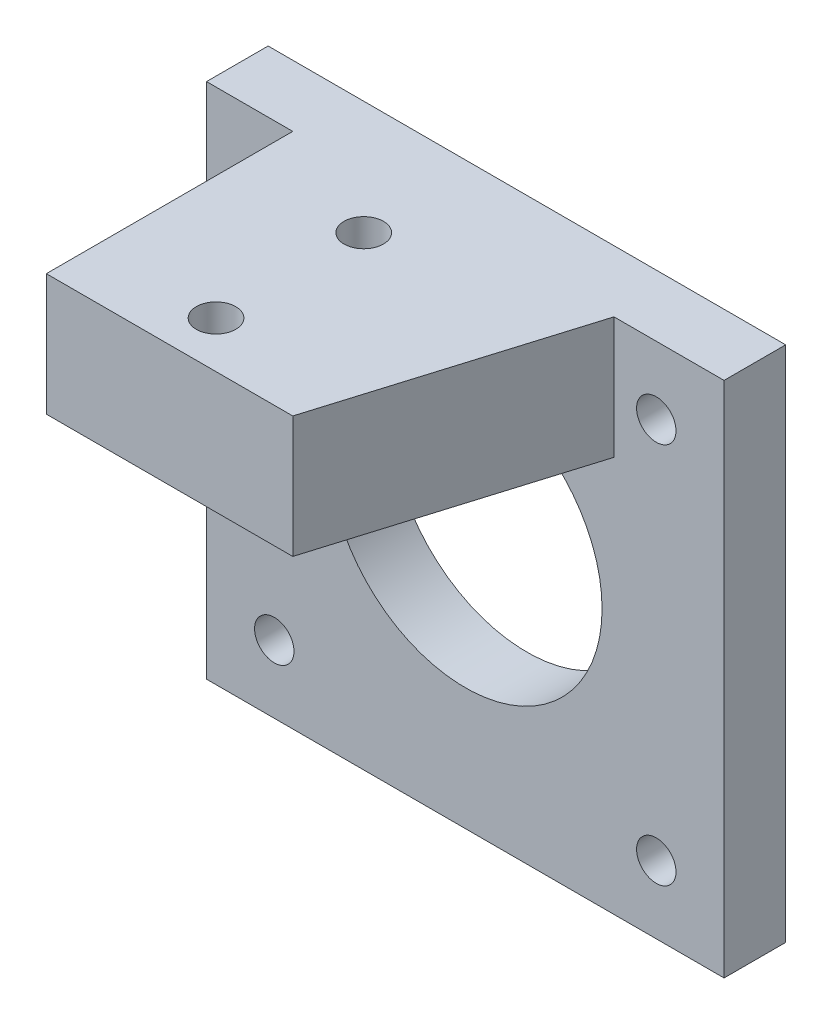
ISO-10303-21;
HEADER;
FILE_DESCRIPTION(('STEP AP214'),'2;1');
FILE_NAME('part.step','',(''),(''),'','','');
FILE_SCHEMA(('AUTOMOTIVE_DESIGN { 1 0 10303 214 1 1 1 1 }'));
ENDSEC;
DATA;
#1=APPLICATION_CONTEXT('core data for automotive mechanical design processes');
#2=APPLICATION_PROTOCOL_DEFINITION('international standard','automotive_design',2000,#1);
#3=PRODUCT_CONTEXT('',#1,'mechanical');
#4=PRODUCT('Part','Part','',(#3));
#5=PRODUCT_RELATED_PRODUCT_CATEGORY('part','',(#4));
#6=PRODUCT_DEFINITION_FORMATION('','',#4);
#7=PRODUCT_DEFINITION_CONTEXT('part definition',#1,'design');
#8=PRODUCT_DEFINITION('design','',#6,#7);
#9=PRODUCT_DEFINITION_SHAPE('','',#8);
#10=(LENGTH_UNIT() NAMED_UNIT(*) SI_UNIT(.MILLI.,.METRE.));
#11=(NAMED_UNIT(*) PLANE_ANGLE_UNIT() SI_UNIT($,.RADIAN.));
#12=(NAMED_UNIT(*) SI_UNIT($,.STERADIAN.) SOLID_ANGLE_UNIT());
#13=UNCERTAINTY_MEASURE_WITH_UNIT(LENGTH_MEASURE(1.E-05),#10,'distance_accuracy_value','');
#14=(GEOMETRIC_REPRESENTATION_CONTEXT(3) GLOBAL_UNCERTAINTY_ASSIGNED_CONTEXT((#13)) GLOBAL_UNIT_ASSIGNED_CONTEXT((#10,
#11,#12)) REPRESENTATION_CONTEXT('',''));
#15=CARTESIAN_POINT('',(0.,0.,0.));
#16=DIRECTION('',(0.,0.,1.));
#17=DIRECTION('',(1.,0.,0.));
#18=AXIS2_PLACEMENT_3D('',#15,#16,#17);
#19=CARTESIAN_POINT('',(17.,52.1256764127012,9.24121157828495));
#20=DIRECTION('',(0.,-1.,0.));
#21=DIRECTION('',(0.,0.,-1.));
#22=AXIS2_PLACEMENT_3D('',#19,#20,#21);
#23=CYLINDRICAL_SURFACE('',#22,1.6);
#24=CARTESIAN_POINT('',(17.,42.,9.24121157828495));
#25=DIRECTION('',(0.,-1.,0.));
#26=DIRECTION('',(0.,0.,-1.));
#27=AXIS2_PLACEMENT_3D('',#24,#25,#26);
#28=CIRCLE('',#27,1.6);
#29=CARTESIAN_POINT('',(17.,42.,7.64121157828495));
#30=VERTEX_POINT('',#29);
#31=EDGE_CURVE('E225',#30,#30,#28,.T.);
#32=ORIENTED_EDGE('',*,*,#31,.F.);
#33=EDGE_LOOP('',(#32));
#34=FACE_BOUND('',#33,.T.);
#35=CARTESIAN_POINT('',(17.,35.1256764127012,9.24121157828495));
#36=DIRECTION('',(0.,-1.,0.));
#37=DIRECTION('',(0.,0.,-1.));
#38=AXIS2_PLACEMENT_3D('',#35,#36,#37);
#39=CIRCLE('',#38,1.6);
#40=CARTESIAN_POINT('',(17.,35.1256764127012,7.64121157828495));
#41=VERTEX_POINT('',#40);
#42=EDGE_CURVE('E38',#41,#41,#39,.F.);
#43=ORIENTED_EDGE('',*,*,#42,.F.);
#44=EDGE_LOOP('',(#43));
#45=FACE_BOUND('',#44,.T.);
#46=ADVANCED_FACE('F34',(#34,#45),#23,.F.);
#47=CARTESIAN_POINT('',(17.,52.1256764127012,21.2289962843215));
#48=DIRECTION('',(0.,-1.,0.));
#49=DIRECTION('',(0.,0.,-1.));
#50=AXIS2_PLACEMENT_3D('',#47,#48,#49);
#51=CYLINDRICAL_SURFACE('',#50,1.6);
#52=CARTESIAN_POINT('',(17.,42.,21.2289962843215));
#53=DIRECTION('',(0.,-1.,0.));
#54=DIRECTION('',(0.,0.,-1.));
#55=AXIS2_PLACEMENT_3D('',#52,#53,#54);
#56=CIRCLE('',#55,1.6);
#57=CARTESIAN_POINT('',(17.,42.,19.6289962843215));
#58=VERTEX_POINT('',#57);
#59=EDGE_CURVE('E218',#58,#58,#56,.T.);
#60=ORIENTED_EDGE('',*,*,#59,.F.);
#61=EDGE_LOOP('',(#60));
#62=FACE_BOUND('',#61,.T.);
#63=CARTESIAN_POINT('',(17.,35.1256764127012,21.2289962843215));
#64=DIRECTION('',(0.,-1.,0.));
#65=DIRECTION('',(0.,0.,-1.));
#66=AXIS2_PLACEMENT_3D('',#63,#64,#65);
#67=CIRCLE('',#66,1.6);
#68=CARTESIAN_POINT('',(17.,35.1256764127012,19.6289962843215));
#69=VERTEX_POINT('',#68);
#70=EDGE_CURVE('E223',#69,#69,#67,.F.);
#71=ORIENTED_EDGE('',*,*,#70,.F.);
#72=EDGE_LOOP('',(#71));
#73=FACE_BOUND('',#72,.T.);
#74=ADVANCED_FACE('F287',(#62,#73),#51,.F.);
#75=CARTESIAN_POINT('',(0.,0.,5.));
#76=DIRECTION('',(0.,0.,-1.));
#77=DIRECTION('',(-1.,0.,0.));
#78=AXIS2_PLACEMENT_3D('',#75,#76,#77);
#79=PLANE('',#78);
#80=CARTESIAN_POINT('',(20.9999999999933,20.9999999999933,5.));
#81=DIRECTION('',(0.,0.,1.));
#82=DIRECTION('',(1.,0.,0.));
#83=AXIS2_PLACEMENT_3D('',#80,#81,#82);
#84=CIRCLE('',#83,11.1);
#85=CARTESIAN_POINT('',(32.0999999999933,20.9999999999933,5.));
#86=VERTEX_POINT('',#85);
#87=EDGE_CURVE('E150',#86,#86,#84,.T.);
#88=ORIENTED_EDGE('',*,*,#87,.F.);
#89=EDGE_LOOP('',(#88));
#90=FACE_BOUND('',#89,.T.);
#91=CARTESIAN_POINT('',(36.4999999999933,36.4999999999933,5.));
#92=DIRECTION('',(0.,0.,1.));
#93=DIRECTION('',(-1.,0.,0.));
#94=AXIS2_PLACEMENT_3D('',#91,#92,#93);
#95=CIRCLE('',#94,1.6);
#96=CARTESIAN_POINT('',(34.8999999999933,36.4999999999933,5.));
#97=VERTEX_POINT('',#96);
#98=EDGE_CURVE('E192',#97,#97,#95,.T.);
#99=ORIENTED_EDGE('',*,*,#98,.F.);
#100=EDGE_LOOP('',(#99));
#101=FACE_BOUND('',#100,.T.);
#102=CARTESIAN_POINT('',(36.4999999999933,5.49999999999329,5.));
#103=DIRECTION('',(0.,0.,1.));
#104=DIRECTION('',(1.,0.,0.));
#105=AXIS2_PLACEMENT_3D('',#102,#103,#104);
#106=CIRCLE('',#105,1.6);
#107=CARTESIAN_POINT('',(38.0999999999933,5.49999999999329,5.));
#108=VERTEX_POINT('',#107);
#109=EDGE_CURVE('E199',#108,#108,#106,.T.);
#110=ORIENTED_EDGE('',*,*,#109,.F.);
#111=EDGE_LOOP('',(#110));
#112=FACE_BOUND('',#111,.T.);
#113=CARTESIAN_POINT('',(5.49999999999329,5.49999999999328,5.));
#114=DIRECTION('',(0.,0.,1.));
#115=DIRECTION('',(-1.,0.,0.));
#116=AXIS2_PLACEMENT_3D('',#113,#114,#115);
#117=CIRCLE('',#116,1.6);
#118=CARTESIAN_POINT('',(3.89999999999329,5.49999999999328,5.));
#119=VERTEX_POINT('',#118);
#120=EDGE_CURVE('E205',#119,#119,#117,.T.);
#121=ORIENTED_EDGE('',*,*,#120,.F.);
#122=EDGE_LOOP('',(#121));
#123=FACE_BOUND('',#122,.T.);
#124=DIRECTION('',(-1.,0.,0.));
#125=VECTOR('',#124,1.);
#126=CARTESIAN_POINT('',(0.,42.,5.));
#127=LINE('',#126,#125);
#128=CARTESIAN_POINT('',(42.,42.,5.));
#129=VERTEX_POINT('',#128);
#130=CARTESIAN_POINT('',(33.0663127071823,42.,5.));
#131=VERTEX_POINT('',#130);
#132=EDGE_CURVE('E122',#129,#131,#127,.T.);
#133=ORIENTED_EDGE('',*,*,#132,.T.);
#134=DIRECTION('',(0.,-1.,0.));
#135=VECTOR('',#134,1.);
#136=CARTESIAN_POINT('',(33.0663127071823,42.,5.));
#137=LINE('',#136,#135);
#138=CARTESIAN_POINT('',(33.0663127071823,32.1256764127012,5.));
#139=VERTEX_POINT('',#138);
#140=EDGE_CURVE('E106',#131,#139,#137,.T.);
#141=ORIENTED_EDGE('',*,*,#140,.T.);
#142=DIRECTION('',(1.,0.,0.));
#143=VECTOR('',#142,1.);
#144=CARTESIAN_POINT('',(7.,32.1256764127012,5.));
#145=LINE('',#144,#143);
#146=CARTESIAN_POINT('',(7.,32.1256764127012,5.));
#147=VERTEX_POINT('',#146);
#148=EDGE_CURVE('E52',#147,#139,#145,.T.);
#149=ORIENTED_EDGE('',*,*,#148,.F.);
#150=DIRECTION('',(0.,-1.,0.));
#151=VECTOR('',#150,1.);
#152=CARTESIAN_POINT('',(7.,42.,5.));
#153=LINE('',#152,#151);
#154=CARTESIAN_POINT('',(7.,35.9432235637284,5.));
#155=VERTEX_POINT('',#154);
#156=EDGE_CURVE('E11',#155,#147,#153,.T.);
#157=ORIENTED_EDGE('',*,*,#156,.F.);
#158=CARTESIAN_POINT('',(5.49999999999329,36.4999999999933,5.));
#159=DIRECTION('',(0.,0.,1.));
#160=DIRECTION('',(1.,0.,0.));
#161=AXIS2_PLACEMENT_3D('',#158,#159,#160);
#162=CIRCLE('',#161,1.6);
#163=CARTESIAN_POINT('',(7.,37.0567764362582,5.));
#164=VERTEX_POINT('',#163);
#165=EDGE_CURVE('E186',#164,#155,#162,.T.);
#166=ORIENTED_EDGE('',*,*,#165,.F.);
#167=CARTESIAN_POINT('',(7.,42.,5.));
#168=VERTEX_POINT('',#167);
#169=EDGE_CURVE('E58',#168,#164,#153,.T.);
#170=ORIENTED_EDGE('',*,*,#169,.F.);
#171=CARTESIAN_POINT('',(0.,42.,5.));
#172=VERTEX_POINT('',#171);
#173=EDGE_CURVE('E131',#168,#172,#127,.T.);
#174=ORIENTED_EDGE('',*,*,#173,.T.);
#175=DIRECTION('',(0.,-1.,0.));
#176=VECTOR('',#175,1.);
#177=CARTESIAN_POINT('',(0.,0.,5.));
#178=LINE('',#177,#176);
#179=CARTESIAN_POINT('',(0.,0.,5.));
#180=VERTEX_POINT('',#179);
#181=EDGE_CURVE('E155',#172,#180,#178,.T.);
#182=ORIENTED_EDGE('',*,*,#181,.T.);
#183=DIRECTION('',(1.,0.,0.));
#184=VECTOR('',#183,1.);
#185=CARTESIAN_POINT('',(0.,0.,5.));
#186=LINE('',#185,#184);
#187=CARTESIAN_POINT('',(42.,0.,5.));
#188=VERTEX_POINT('',#187);
#189=EDGE_CURVE('E166',#180,#188,#186,.T.);
#190=ORIENTED_EDGE('',*,*,#189,.T.);
#191=DIRECTION('',(0.,1.,0.));
#192=VECTOR('',#191,1.);
#193=CARTESIAN_POINT('',(42.,0.,5.));
#194=LINE('',#193,#192);
#195=EDGE_CURVE('E128',#188,#129,#194,.T.);
#196=ORIENTED_EDGE('',*,*,#195,.T.);
#197=EDGE_LOOP('',(#133,#141,#149,#157,#166,#170,#174,#182,#190,#196));
#198=FACE_BOUND('',#197,.T.);
#199=ADVANCED_FACE('F126',(#90,#101,#112,#123,#198),#79,.F.);
#200=CARTESIAN_POINT('',(0.,0.,0.));
#201=DIRECTION('',(0.,0.,-1.));
#202=DIRECTION('',(-1.,0.,0.));
#203=AXIS2_PLACEMENT_3D('',#200,#201,#202);
#204=PLANE('',#203);
#205=CARTESIAN_POINT('',(5.49999999999329,5.49999999999328,0.));
#206=DIRECTION('',(0.,0.,1.));
#207=DIRECTION('',(-1.,0.,0.));
#208=AXIS2_PLACEMENT_3D('',#205,#206,#207);
#209=CIRCLE('',#208,1.6);
#210=CARTESIAN_POINT('',(3.89999999999329,5.49999999999328,0.));
#211=VERTEX_POINT('',#210);
#212=EDGE_CURVE('E202',#211,#211,#209,.T.);
#213=ORIENTED_EDGE('',*,*,#212,.T.);
#214=EDGE_LOOP('',(#213));
#215=FACE_BOUND('',#214,.T.);
#216=CARTESIAN_POINT('',(36.4999999999933,5.49999999999329,0.));
#217=DIRECTION('',(0.,0.,1.));
#218=DIRECTION('',(1.,0.,0.));
#219=AXIS2_PLACEMENT_3D('',#216,#217,#218);
#220=CIRCLE('',#219,1.6);
#221=CARTESIAN_POINT('',(38.0999999999933,5.49999999999329,0.));
#222=VERTEX_POINT('',#221);
#223=EDGE_CURVE('E196',#222,#222,#220,.T.);
#224=ORIENTED_EDGE('',*,*,#223,.T.);
#225=EDGE_LOOP('',(#224));
#226=FACE_BOUND('',#225,.T.);
#227=CARTESIAN_POINT('',(36.4999999999933,36.4999999999933,0.));
#228=DIRECTION('',(0.,0.,1.));
#229=DIRECTION('',(-1.,0.,0.));
#230=AXIS2_PLACEMENT_3D('',#227,#228,#229);
#231=CIRCLE('',#230,1.6);
#232=CARTESIAN_POINT('',(34.8999999999933,36.4999999999933,0.));
#233=VERTEX_POINT('',#232);
#234=EDGE_CURVE('E195',#233,#233,#231,.T.);
#235=ORIENTED_EDGE('',*,*,#234,.T.);
#236=EDGE_LOOP('',(#235));
#237=FACE_BOUND('',#236,.T.);
#238=CARTESIAN_POINT('',(5.49999999999329,36.4999999999933,0.));
#239=DIRECTION('',(0.,0.,1.));
#240=DIRECTION('',(1.,0.,0.));
#241=AXIS2_PLACEMENT_3D('',#238,#239,#240);
#242=CIRCLE('',#241,1.6);
#243=CARTESIAN_POINT('',(7.09999999999329,36.4999999999933,0.));
#244=VERTEX_POINT('',#243);
#245=EDGE_CURVE('E183',#244,#244,#242,.T.);
#246=ORIENTED_EDGE('',*,*,#245,.T.);
#247=EDGE_LOOP('',(#246));
#248=FACE_BOUND('',#247,.T.);
#249=DIRECTION('',(0.,-1.,0.));
#250=VECTOR('',#249,1.);
#251=CARTESIAN_POINT('',(0.,0.,0.));
#252=LINE('',#251,#250);
#253=CARTESIAN_POINT('',(0.,42.,0.));
#254=VERTEX_POINT('',#253);
#255=CARTESIAN_POINT('',(0.,0.,0.));
#256=VERTEX_POINT('',#255);
#257=EDGE_CURVE('E145',#254,#256,#252,.T.);
#258=ORIENTED_EDGE('',*,*,#257,.F.);
#259=DIRECTION('',(-1.,0.,0.));
#260=VECTOR('',#259,1.);
#261=CARTESIAN_POINT('',(0.,42.,0.));
#262=LINE('',#261,#260);
#263=CARTESIAN_POINT('',(42.,42.,0.));
#264=VERTEX_POINT('',#263);
#265=EDGE_CURVE('E154',#264,#254,#262,.T.);
#266=ORIENTED_EDGE('',*,*,#265,.F.);
#267=DIRECTION('',(0.,1.,0.));
#268=VECTOR('',#267,1.);
#269=CARTESIAN_POINT('',(42.,0.,0.));
#270=LINE('',#269,#268);
#271=CARTESIAN_POINT('',(42.,0.,0.));
#272=VERTEX_POINT('',#271);
#273=EDGE_CURVE('E152',#272,#264,#270,.T.);
#274=ORIENTED_EDGE('',*,*,#273,.F.);
#275=DIRECTION('',(1.,0.,0.));
#276=VECTOR('',#275,1.);
#277=CARTESIAN_POINT('',(0.,0.,0.));
#278=LINE('',#277,#276);
#279=EDGE_CURVE('E149',#256,#272,#278,.T.);
#280=ORIENTED_EDGE('',*,*,#279,.F.);
#281=EDGE_LOOP('',(#258,#266,#274,#280));
#282=FACE_BOUND('',#281,.T.);
#283=CARTESIAN_POINT('',(20.9999999999933,20.9999999999933,0.));
#284=DIRECTION('',(0.,0.,1.));
#285=DIRECTION('',(1.,0.,0.));
#286=AXIS2_PLACEMENT_3D('',#283,#284,#285);
#287=CIRCLE('',#286,11.1);
#288=CARTESIAN_POINT('',(32.0999999999933,20.9999999999933,0.));
#289=VERTEX_POINT('',#288);
#290=EDGE_CURVE('E180',#289,#289,#287,.T.);
#291=ORIENTED_EDGE('',*,*,#290,.T.);
#292=EDGE_LOOP('',(#291));
#293=FACE_BOUND('',#292,.T.);
#294=ADVANCED_FACE('F174',(#215,#226,#237,#248,#282,#293),#204,.T.);
#295=CARTESIAN_POINT('',(0.,0.,5.));
#296=DIRECTION('',(1.,0.,0.));
#297=DIRECTION('',(0.,0.,-1.));
#298=AXIS2_PLACEMENT_3D('',#295,#296,#297);
#299=PLANE('',#298);
#300=ORIENTED_EDGE('',*,*,#257,.T.);
#301=DIRECTION('',(0.,0.,-1.));
#302=VECTOR('',#301,1.);
#303=CARTESIAN_POINT('',(0.,0.,5.));
#304=LINE('',#303,#302);
#305=EDGE_CURVE('E43',#180,#256,#304,.T.);
#306=ORIENTED_EDGE('',*,*,#305,.F.);
#307=ORIENTED_EDGE('',*,*,#181,.F.);
#308=DIRECTION('',(0.,0.,-1.));
#309=VECTOR('',#308,1.);
#310=CARTESIAN_POINT('',(0.,42.,5.));
#311=LINE('',#310,#309);
#312=EDGE_CURVE('E130',#172,#254,#311,.T.);
#313=ORIENTED_EDGE('',*,*,#312,.T.);
#314=EDGE_LOOP('',(#300,#306,#307,#313));
#315=FACE_BOUND('',#314,.T.);
#316=ADVANCED_FACE('F36',(#315),#299,.F.);
#317=CARTESIAN_POINT('',(0.,0.,5.));
#318=DIRECTION('',(0.,1.,0.));
#319=DIRECTION('',(0.,0.,1.));
#320=AXIS2_PLACEMENT_3D('',#317,#318,#319);
#321=PLANE('',#320);
#322=ORIENTED_EDGE('',*,*,#279,.T.);
#323=DIRECTION('',(0.,0.,-1.));
#324=VECTOR('',#323,1.);
#325=CARTESIAN_POINT('',(42.,0.,5.));
#326=LINE('',#325,#324);
#327=EDGE_CURVE('E157',#188,#272,#326,.T.);
#328=ORIENTED_EDGE('',*,*,#327,.F.);
#329=ORIENTED_EDGE('',*,*,#189,.F.);
#330=ORIENTED_EDGE('',*,*,#305,.T.);
#331=EDGE_LOOP('',(#322,#328,#329,#330));
#332=FACE_BOUND('',#331,.T.);
#333=ADVANCED_FACE('F165',(#332),#321,.F.);
#334=CARTESIAN_POINT('',(42.,0.,5.));
#335=DIRECTION('',(-1.,0.,0.));
#336=DIRECTION('',(0.,0.,1.));
#337=AXIS2_PLACEMENT_3D('',#334,#335,#336);
#338=PLANE('',#337);
#339=ORIENTED_EDGE('',*,*,#273,.T.);
#340=DIRECTION('',(0.,0.,-1.));
#341=VECTOR('',#340,1.);
#342=CARTESIAN_POINT('',(42.,42.,5.));
#343=LINE('',#342,#341);
#344=EDGE_CURVE('E134',#129,#264,#343,.T.);
#345=ORIENTED_EDGE('',*,*,#344,.F.);
#346=ORIENTED_EDGE('',*,*,#195,.F.);
#347=ORIENTED_EDGE('',*,*,#327,.T.);
#348=EDGE_LOOP('',(#339,#345,#346,#347));
#349=FACE_BOUND('',#348,.T.);
#350=ADVANCED_FACE('F176',(#349),#338,.F.);
#351=CARTESIAN_POINT('',(0.,42.,5.));
#352=DIRECTION('',(0.,-1.,0.));
#353=DIRECTION('',(0.,0.,-1.));
#354=AXIS2_PLACEMENT_3D('',#351,#352,#353);
#355=PLANE('',#354);
#356=DIRECTION('',(-0.290257469211628,0.,0.956948588779387));
#357=VECTOR('',#356,1.);
#358=CARTESIAN_POINT('',(33.0663127071823,42.,5.));
#359=LINE('',#358,#357);
#360=CARTESIAN_POINT('',(27.,42.,25.));
#361=VERTEX_POINT('',#360);
#362=EDGE_CURVE('E109',#131,#361,#359,.T.);
#363=ORIENTED_EDGE('',*,*,#362,.F.);
#364=ORIENTED_EDGE('',*,*,#132,.F.);
#365=ORIENTED_EDGE('',*,*,#344,.T.);
#366=ORIENTED_EDGE('',*,*,#265,.T.);
#367=ORIENTED_EDGE('',*,*,#312,.F.);
#368=ORIENTED_EDGE('',*,*,#173,.F.);
#369=DIRECTION('',(0.,0.,-1.));
#370=VECTOR('',#369,1.);
#371=CARTESIAN_POINT('',(7.,42.,25.));
#372=LINE('',#371,#370);
#373=CARTESIAN_POINT('',(7.,42.,25.));
#374=VERTEX_POINT('',#373);
#375=EDGE_CURVE('E213',#374,#168,#372,.T.);
#376=ORIENTED_EDGE('',*,*,#375,.F.);
#377=DIRECTION('',(-1.,0.,0.));
#378=VECTOR('',#377,1.);
#379=CARTESIAN_POINT('',(7.,42.,25.));
#380=LINE('',#379,#378);
#381=EDGE_CURVE('E124',#361,#374,#380,.T.);
#382=ORIENTED_EDGE('',*,*,#381,.F.);
#383=EDGE_LOOP('',(#363,#364,#365,#366,#367,#368,#376,#382));
#384=FACE_BOUND('',#383,.T.);
#385=ORIENTED_EDGE('',*,*,#31,.T.);
#386=EDGE_LOOP('',(#385));
#387=FACE_BOUND('',#386,.T.);
#388=ORIENTED_EDGE('',*,*,#59,.T.);
#389=EDGE_LOOP('',(#388));
#390=FACE_BOUND('',#389,.T.);
#391=ADVANCED_FACE('F119',(#384,#387,#390),#355,.F.);
#392=CARTESIAN_POINT('',(20.9999999999933,20.9999999999933,5.));
#393=DIRECTION('',(0.,0.,-1.));
#394=DIRECTION('',(-1.,0.,0.));
#395=AXIS2_PLACEMENT_3D('',#392,#393,#394);
#396=CYLINDRICAL_SURFACE('',#395,11.1);
#397=ORIENTED_EDGE('',*,*,#87,.T.);
#398=EDGE_LOOP('',(#397));
#399=FACE_BOUND('',#398,.T.);
#400=ORIENTED_EDGE('',*,*,#290,.F.);
#401=EDGE_LOOP('',(#400));
#402=FACE_BOUND('',#401,.T.);
#403=ADVANCED_FACE('F319',(#399,#402),#396,.F.);
#404=CARTESIAN_POINT('',(5.49999999999329,36.4999999999933,0.));
#405=DIRECTION('',(0.,0.,1.));
#406=DIRECTION('',(1.,0.,0.));
#407=AXIS2_PLACEMENT_3D('',#404,#405,#406);
#408=CYLINDRICAL_SURFACE('',#407,1.6);
#409=ORIENTED_EDGE('',*,*,#245,.F.);
#410=EDGE_LOOP('',(#409));
#411=FACE_BOUND('',#410,.T.);
#412=ORIENTED_EDGE('',*,*,#165,.T.);
#413=EDGE_CURVE('E189',#155,#164,#162,.T.);
#414=ORIENTED_EDGE('',*,*,#413,.T.);
#415=EDGE_LOOP('',(#412,#414));
#416=FACE_BOUND('',#415,.T.);
#417=ADVANCED_FACE('F315',(#411,#416),#408,.F.);
#418=CARTESIAN_POINT('',(36.4999999999933,36.4999999999933,0.));
#419=DIRECTION('',(0.,0.,1.));
#420=DIRECTION('',(1.,0.,0.));
#421=AXIS2_PLACEMENT_3D('',#418,#419,#420);
#422=CYLINDRICAL_SURFACE('',#421,1.6);
#423=ORIENTED_EDGE('',*,*,#234,.F.);
#424=EDGE_LOOP('',(#423));
#425=FACE_BOUND('',#424,.T.);
#426=ORIENTED_EDGE('',*,*,#98,.T.);
#427=EDGE_LOOP('',(#426));
#428=FACE_BOUND('',#427,.T.);
#429=ADVANCED_FACE('F311',(#425,#428),#422,.F.);
#430=CARTESIAN_POINT('',(36.4999999999933,5.49999999999329,0.));
#431=DIRECTION('',(0.,0.,1.));
#432=DIRECTION('',(1.,0.,0.));
#433=AXIS2_PLACEMENT_3D('',#430,#431,#432);
#434=CYLINDRICAL_SURFACE('',#433,1.6);
#435=ORIENTED_EDGE('',*,*,#223,.F.);
#436=EDGE_LOOP('',(#435));
#437=FACE_BOUND('',#436,.T.);
#438=ORIENTED_EDGE('',*,*,#109,.T.);
#439=EDGE_LOOP('',(#438));
#440=FACE_BOUND('',#439,.T.);
#441=ADVANCED_FACE('F307',(#437,#440),#434,.F.);
#442=CARTESIAN_POINT('',(5.49999999999329,5.49999999999328,0.));
#443=DIRECTION('',(0.,0.,1.));
#444=DIRECTION('',(1.,0.,0.));
#445=AXIS2_PLACEMENT_3D('',#442,#443,#444);
#446=CYLINDRICAL_SURFACE('',#445,1.6);
#447=ORIENTED_EDGE('',*,*,#212,.F.);
#448=EDGE_LOOP('',(#447));
#449=FACE_BOUND('',#448,.T.);
#450=ORIENTED_EDGE('',*,*,#120,.T.);
#451=EDGE_LOOP('',(#450));
#452=FACE_BOUND('',#451,.T.);
#453=ADVANCED_FACE('F304',(#449,#452),#446,.F.);
#454=CARTESIAN_POINT('',(7.,42.,25.));
#455=DIRECTION('',(1.,0.,0.));
#456=DIRECTION('',(0.,1.,0.));
#457=AXIS2_PLACEMENT_3D('',#454,#455,#456);
#458=PLANE('',#457);
#459=ORIENTED_EDGE('',*,*,#169,.T.);
#460=EDGE_CURVE('E45',#164,#155,#153,.T.);
#461=ORIENTED_EDGE('',*,*,#460,.T.);
#462=ORIENTED_EDGE('',*,*,#156,.T.);
#463=DIRECTION('',(0.,0.,-1.));
#464=VECTOR('',#463,1.);
#465=CARTESIAN_POINT('',(7.,32.1256764127012,25.));
#466=LINE('',#465,#464);
#467=CARTESIAN_POINT('',(7.,32.1256764127012,25.));
#468=VERTEX_POINT('',#467);
#469=EDGE_CURVE('E208',#468,#147,#466,.T.);
#470=ORIENTED_EDGE('',*,*,#469,.F.);
#471=DIRECTION('',(0.,-1.,0.));
#472=VECTOR('',#471,1.);
#473=CARTESIAN_POINT('',(7.,42.,25.));
#474=LINE('',#473,#472);
#475=EDGE_CURVE('E214',#374,#468,#474,.T.);
#476=ORIENTED_EDGE('',*,*,#475,.F.);
#477=ORIENTED_EDGE('',*,*,#375,.T.);
#478=EDGE_LOOP('',(#459,#461,#462,#470,#476,#477));
#479=FACE_BOUND('',#478,.T.);
#480=ADVANCED_FACE('F253',(#479),#458,.F.);
#481=CARTESIAN_POINT('',(7.,32.1256764127012,25.));
#482=DIRECTION('',(0.,1.,0.));
#483=DIRECTION('',(0.,0.,1.));
#484=AXIS2_PLACEMENT_3D('',#481,#482,#483);
#485=PLANE('',#484);
#486=CARTESIAN_POINT('',(17.,32.1256764127012,9.24121157828495));
#487=DIRECTION('',(0.,-1.,0.));
#488=DIRECTION('',(0.,0.,-1.));
#489=AXIS2_PLACEMENT_3D('',#486,#487,#488);
#490=CIRCLE('',#489,3.);
#491=CARTESIAN_POINT('',(17.,32.1256764127012,6.24121157828495));
#492=VERTEX_POINT('',#491);
#493=EDGE_CURVE('E114',#492,#492,#490,.T.);
#494=ORIENTED_EDGE('',*,*,#493,.F.);
#495=EDGE_LOOP('',(#494));
#496=FACE_BOUND('',#495,.T.);
#497=CARTESIAN_POINT('',(17.,32.1256764127012,21.2289962843215));
#498=DIRECTION('',(0.,-1.,0.));
#499=DIRECTION('',(0.,0.,-1.));
#500=AXIS2_PLACEMENT_3D('',#497,#498,#499);
#501=CIRCLE('',#500,3.);
#502=CARTESIAN_POINT('',(17.,32.1256764127012,18.2289962843215));
#503=VERTEX_POINT('',#502);
#504=EDGE_CURVE('E232',#503,#503,#501,.T.);
#505=ORIENTED_EDGE('',*,*,#504,.F.);
#506=EDGE_LOOP('',(#505));
#507=FACE_BOUND('',#506,.T.);
#508=ORIENTED_EDGE('',*,*,#148,.T.);
#509=DIRECTION('',(-0.290257469211628,0.,0.956948588779387));
#510=VECTOR('',#509,1.);
#511=CARTESIAN_POINT('',(33.0663127071823,32.1256764127012,5.));
#512=LINE('',#511,#510);
#513=CARTESIAN_POINT('',(27.,32.1256764127012,25.));
#514=VERTEX_POINT('',#513);
#515=EDGE_CURVE('E112',#139,#514,#512,.T.);
#516=ORIENTED_EDGE('',*,*,#515,.T.);
#517=DIRECTION('',(1.,0.,0.));
#518=VECTOR('',#517,1.);
#519=CARTESIAN_POINT('',(7.,32.1256764127012,25.));
#520=LINE('',#519,#518);
#521=EDGE_CURVE('E245',#468,#514,#520,.T.);
#522=ORIENTED_EDGE('',*,*,#521,.F.);
#523=ORIENTED_EDGE('',*,*,#469,.T.);
#524=EDGE_LOOP('',(#508,#516,#522,#523));
#525=FACE_BOUND('',#524,.T.);
#526=ADVANCED_FACE('F255',(#496,#507,#525),#485,.F.);
#527=CARTESIAN_POINT('',(0.,0.,25.));
#528=DIRECTION('',(0.,0.,1.));
#529=DIRECTION('',(1.,0.,0.));
#530=AXIS2_PLACEMENT_3D('',#527,#528,#529);
#531=PLANE('',#530);
#532=ORIENTED_EDGE('',*,*,#475,.T.);
#533=ORIENTED_EDGE('',*,*,#521,.T.);
#534=DIRECTION('',(0.,1.,0.));
#535=VECTOR('',#534,1.);
#536=CARTESIAN_POINT('',(27.,42.,25.));
#537=LINE('',#536,#535);
#538=EDGE_CURVE('E247',#514,#361,#537,.T.);
#539=ORIENTED_EDGE('',*,*,#538,.T.);
#540=ORIENTED_EDGE('',*,*,#381,.T.);
#541=EDGE_LOOP('',(#532,#533,#539,#540));
#542=FACE_BOUND('',#541,.T.);
#543=ADVANCED_FACE('F249',(#542),#531,.T.);
#544=CARTESIAN_POINT('',(0.,0.,5.));
#545=DIRECTION('',(0.,0.,1.));
#546=DIRECTION('',(1.,0.,0.));
#547=AXIS2_PLACEMENT_3D('',#544,#545,#546);
#548=PLANE('',#547);
#549=ORIENTED_EDGE('',*,*,#413,.F.);
#550=ORIENTED_EDGE('',*,*,#460,.F.);
#551=EDGE_LOOP('',(#549,#550));
#552=FACE_BOUND('',#551,.T.);
#553=ADVANCED_FACE('F283',(#552),#548,.F.);
#554=CARTESIAN_POINT('',(17.,35.1256764127012,21.2289962843215));
#555=DIRECTION('',(0.,-1.,0.));
#556=DIRECTION('',(0.,0.,-1.));
#557=AXIS2_PLACEMENT_3D('',#554,#555,#556);
#558=PLANE('',#557);
#559=CARTESIAN_POINT('',(17.,35.1256764127012,21.2289962843215));
#560=DIRECTION('',(0.,-1.,0.));
#561=DIRECTION('',(0.,0.,-1.));
#562=AXIS2_PLACEMENT_3D('',#559,#560,#561);
#563=CIRCLE('',#562,3.);
#564=CARTESIAN_POINT('',(17.,35.1256764127012,18.2289962843215));
#565=VERTEX_POINT('',#564);
#566=EDGE_CURVE('E226',#565,#565,#563,.T.);
#567=ORIENTED_EDGE('',*,*,#566,.T.);
#568=EDGE_LOOP('',(#567));
#569=FACE_BOUND('',#568,.T.);
#570=ORIENTED_EDGE('',*,*,#70,.T.);
#571=EDGE_LOOP('',(#570));
#572=FACE_BOUND('',#571,.T.);
#573=ADVANCED_FACE('F275',(#569,#572),#558,.T.);
#574=CARTESIAN_POINT('',(17.,35.1256764127012,21.2289962843215));
#575=DIRECTION('',(0.,-1.,0.));
#576=DIRECTION('',(0.,0.,-1.));
#577=AXIS2_PLACEMENT_3D('',#574,#575,#576);
#578=CYLINDRICAL_SURFACE('',#577,3.);
#579=ORIENTED_EDGE('',*,*,#566,.F.);
#580=EDGE_LOOP('',(#579));
#581=FACE_BOUND('',#580,.T.);
#582=ORIENTED_EDGE('',*,*,#504,.T.);
#583=EDGE_LOOP('',(#582));
#584=FACE_BOUND('',#583,.T.);
#585=ADVANCED_FACE('F272',(#581,#584),#578,.F.);
#586=CARTESIAN_POINT('',(17.,35.1256764127012,9.24121157828495));
#587=DIRECTION('',(0.,-1.,0.));
#588=DIRECTION('',(0.,0.,-1.));
#589=AXIS2_PLACEMENT_3D('',#586,#587,#588);
#590=PLANE('',#589);
#591=CARTESIAN_POINT('',(17.,35.1256764127012,9.24121157828495));
#592=DIRECTION('',(0.,-1.,0.));
#593=DIRECTION('',(0.,0.,-1.));
#594=AXIS2_PLACEMENT_3D('',#591,#592,#593);
#595=CIRCLE('',#594,3.);
#596=CARTESIAN_POINT('',(17.,35.1256764127012,6.24121157828495));
#597=VERTEX_POINT('',#596);
#598=EDGE_CURVE('E257',#597,#597,#595,.T.);
#599=ORIENTED_EDGE('',*,*,#598,.T.);
#600=EDGE_LOOP('',(#599));
#601=FACE_BOUND('',#600,.T.);
#602=ORIENTED_EDGE('',*,*,#42,.T.);
#603=EDGE_LOOP('',(#602));
#604=FACE_BOUND('',#603,.T.);
#605=ADVANCED_FACE('F274',(#601,#604),#590,.T.);
#606=CARTESIAN_POINT('',(17.,35.1256764127012,9.24121157828495));
#607=DIRECTION('',(0.,-1.,0.));
#608=DIRECTION('',(0.,0.,-1.));
#609=AXIS2_PLACEMENT_3D('',#606,#607,#608);
#610=CYLINDRICAL_SURFACE('',#609,3.);
#611=ORIENTED_EDGE('',*,*,#598,.F.);
#612=EDGE_LOOP('',(#611));
#613=FACE_BOUND('',#612,.T.);
#614=ORIENTED_EDGE('',*,*,#493,.T.);
#615=EDGE_LOOP('',(#614));
#616=FACE_BOUND('',#615,.T.);
#617=ADVANCED_FACE('F265',(#613,#616),#610,.F.);
#618=CARTESIAN_POINT('',(33.0663127071823,42.,5.));
#619=DIRECTION('',(0.956948588779387,0.,0.290257469211628));
#620=DIRECTION('',(0.290257469211628,0.,-0.956948588779387));
#621=AXIS2_PLACEMENT_3D('',#618,#619,#620);
#622=PLANE('',#621);
#623=ORIENTED_EDGE('',*,*,#515,.F.);
#624=ORIENTED_EDGE('',*,*,#140,.F.);
#625=ORIENTED_EDGE('',*,*,#362,.T.);
#626=ORIENTED_EDGE('',*,*,#538,.F.);
#627=EDGE_LOOP('',(#623,#624,#625,#626));
#628=FACE_BOUND('',#627,.T.);
#629=ADVANCED_FACE('F108',(#628),#622,.T.);
#630=CLOSED_SHELL('',(#46,#74,#199,#294,#316,#333,#350,#391,#403,#417,#429,#441,#453,#480,#526,
#543,#553,#573,#585,#605,#617,#629));
#631=MANIFOLD_SOLID_BREP('B2',#630);
#632=ADVANCED_BREP_SHAPE_REPRESENTATION('',(#18,#631),#14);
#633=SHAPE_DEFINITION_REPRESENTATION(#9,#632);
ENDSEC;
END-ISO-10303-21;
